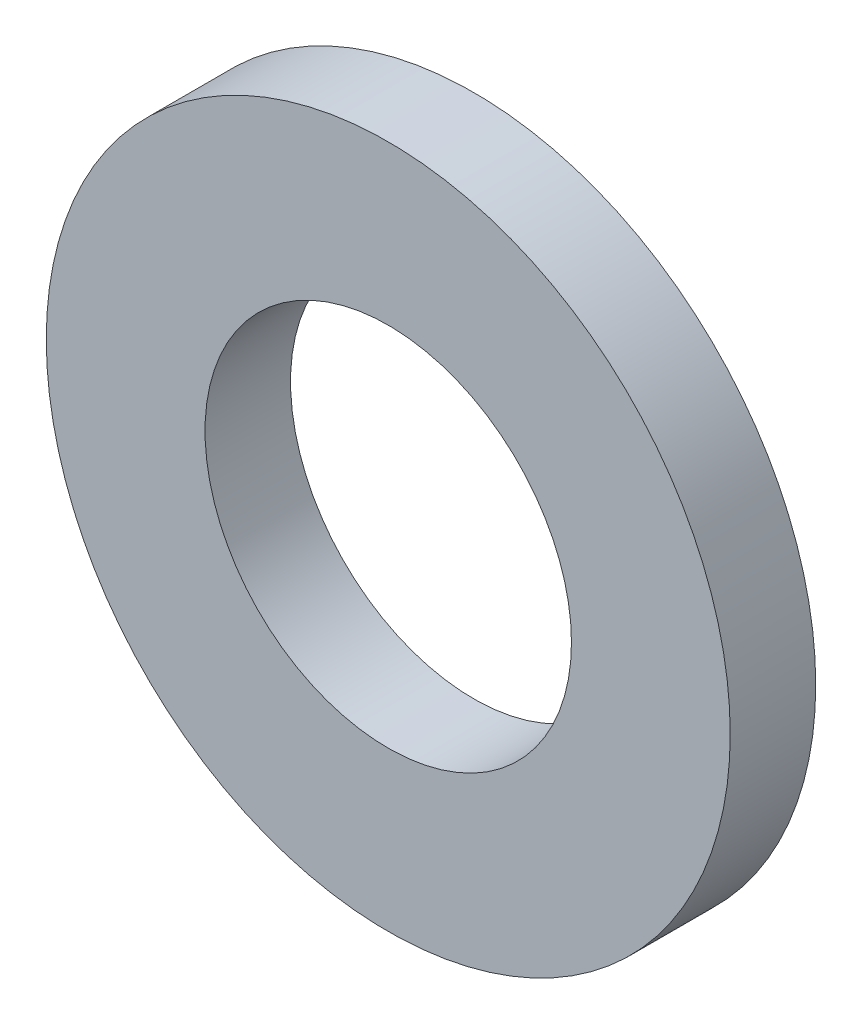
ISO-10303-21;
HEADER;
FILE_DESCRIPTION(('STEP AP214'),'2;1');
FILE_NAME('part.step','',(''),(''),'','','');
FILE_SCHEMA(('AUTOMOTIVE_DESIGN { 1 0 10303 214 1 1 1 1 }'));
ENDSEC;
DATA;
#1=APPLICATION_CONTEXT('core data for automotive mechanical design processes');
#2=APPLICATION_PROTOCOL_DEFINITION('international standard','automotive_design',2000,#1);
#3=PRODUCT_CONTEXT('',#1,'mechanical');
#4=PRODUCT('Part','Part','',(#3));
#5=PRODUCT_RELATED_PRODUCT_CATEGORY('part','',(#4));
#6=PRODUCT_DEFINITION_FORMATION('','',#4);
#7=PRODUCT_DEFINITION_CONTEXT('part definition',#1,'design');
#8=PRODUCT_DEFINITION('design','',#6,#7);
#9=PRODUCT_DEFINITION_SHAPE('','',#8);
#10=(LENGTH_UNIT() NAMED_UNIT(*) SI_UNIT(.MILLI.,.METRE.));
#11=(NAMED_UNIT(*) PLANE_ANGLE_UNIT() SI_UNIT($,.RADIAN.));
#12=(NAMED_UNIT(*) SI_UNIT($,.STERADIAN.) SOLID_ANGLE_UNIT());
#13=UNCERTAINTY_MEASURE_WITH_UNIT(LENGTH_MEASURE(1.E-05),#10,'distance_accuracy_value','');
#14=(GEOMETRIC_REPRESENTATION_CONTEXT(3) GLOBAL_UNCERTAINTY_ASSIGNED_CONTEXT((#13)) GLOBAL_UNIT_ASSIGNED_CONTEXT((#10,
#11,#12)) REPRESENTATION_CONTEXT('',''));
#15=CARTESIAN_POINT('',(0.,0.,0.));
#16=DIRECTION('',(0.,0.,1.));
#17=DIRECTION('',(1.,0.,0.));
#18=AXIS2_PLACEMENT_3D('',#15,#16,#17);
#19=CARTESIAN_POINT('',(0.,0.,3.5));
#20=DIRECTION('',(0.,0.,1.));
#21=DIRECTION('',(1.,0.,0.));
#22=AXIS2_PLACEMENT_3D('',#19,#20,#21);
#23=PLANE('',#22);
#24=CARTESIAN_POINT('',(0.,0.,3.5));
#25=DIRECTION('',(0.,0.,1.));
#26=DIRECTION('',(1.,0.,0.));
#27=AXIS2_PLACEMENT_3D('',#24,#25,#26);
#28=CIRCLE('',#27,14.);
#29=CARTESIAN_POINT('',(14.,0.,3.5));
#30=VERTEX_POINT('',#29);
#31=EDGE_CURVE('E10',#30,#30,#28,.T.);
#32=ORIENTED_EDGE('',*,*,#31,.T.);
#33=EDGE_LOOP('',(#32));
#34=FACE_BOUND('',#33,.T.);
#35=CARTESIAN_POINT('',(0.,0.,3.5));
#36=DIRECTION('',(0.,0.,1.));
#37=DIRECTION('',(1.,0.,0.));
#38=AXIS2_PLACEMENT_3D('',#35,#36,#37);
#39=CIRCLE('',#38,7.5);
#40=CARTESIAN_POINT('',(7.5,0.,3.5));
#41=VERTEX_POINT('',#40);
#42=EDGE_CURVE('E50',#41,#41,#39,.T.);
#43=ORIENTED_EDGE('',*,*,#42,.F.);
#44=EDGE_LOOP('',(#43));
#45=FACE_BOUND('',#44,.T.);
#46=ADVANCED_FACE('F39',(#34,#45),#23,.T.);
#47=CARTESIAN_POINT('',(0.,0.,0.));
#48=DIRECTION('',(0.,0.,1.));
#49=DIRECTION('',(1.,0.,0.));
#50=AXIS2_PLACEMENT_3D('',#47,#48,#49);
#51=PLANE('',#50);
#52=CARTESIAN_POINT('',(0.,0.,0.));
#53=DIRECTION('',(0.,0.,1.));
#54=DIRECTION('',(1.,0.,0.));
#55=AXIS2_PLACEMENT_3D('',#52,#53,#54);
#56=CIRCLE('',#55,14.);
#57=CARTESIAN_POINT('',(14.,0.,0.));
#58=VERTEX_POINT('',#57);
#59=EDGE_CURVE('E43',#58,#58,#56,.T.);
#60=ORIENTED_EDGE('',*,*,#59,.F.);
#61=EDGE_LOOP('',(#60));
#62=FACE_BOUND('',#61,.T.);
#63=CARTESIAN_POINT('',(0.,0.,0.));
#64=DIRECTION('',(0.,0.,1.));
#65=DIRECTION('',(1.,0.,0.));
#66=AXIS2_PLACEMENT_3D('',#63,#64,#65);
#67=CIRCLE('',#66,7.5);
#68=CARTESIAN_POINT('',(7.5,0.,0.));
#69=VERTEX_POINT('',#68);
#70=EDGE_CURVE('E52',#69,#69,#67,.T.);
#71=ORIENTED_EDGE('',*,*,#70,.T.);
#72=EDGE_LOOP('',(#71));
#73=FACE_BOUND('',#72,.T.);
#74=ADVANCED_FACE('F62',(#62,#73),#51,.F.);
#75=CARTESIAN_POINT('',(0.,0.,3.5));
#76=DIRECTION('',(0.,0.,-1.));
#77=DIRECTION('',(-1.,0.,0.));
#78=AXIS2_PLACEMENT_3D('',#75,#76,#77);
#79=CYLINDRICAL_SURFACE('',#78,14.);
#80=ORIENTED_EDGE('',*,*,#31,.F.);
#81=EDGE_LOOP('',(#80));
#82=FACE_BOUND('',#81,.T.);
#83=ORIENTED_EDGE('',*,*,#59,.T.);
#84=EDGE_LOOP('',(#83));
#85=FACE_BOUND('',#84,.T.);
#86=ADVANCED_FACE('F41',(#82,#85),#79,.T.);
#87=CARTESIAN_POINT('',(0.,0.,3.5));
#88=DIRECTION('',(0.,0.,-1.));
#89=DIRECTION('',(-1.,0.,0.));
#90=AXIS2_PLACEMENT_3D('',#87,#88,#89);
#91=CYLINDRICAL_SURFACE('',#90,7.5);
#92=ORIENTED_EDGE('',*,*,#42,.T.);
#93=EDGE_LOOP('',(#92));
#94=FACE_BOUND('',#93,.T.);
#95=ORIENTED_EDGE('',*,*,#70,.F.);
#96=EDGE_LOOP('',(#95));
#97=FACE_BOUND('',#96,.T.);
#98=ADVANCED_FACE('F58',(#94,#97),#91,.F.);
#99=CLOSED_SHELL('',(#46,#74,#86,#98));
#100=MANIFOLD_SOLID_BREP('B2',#99);
#101=ADVANCED_BREP_SHAPE_REPRESENTATION('',(#18,#100),#14);
#102=SHAPE_DEFINITION_REPRESENTATION(#9,#101);
ENDSEC;
END-ISO-10303-21;
